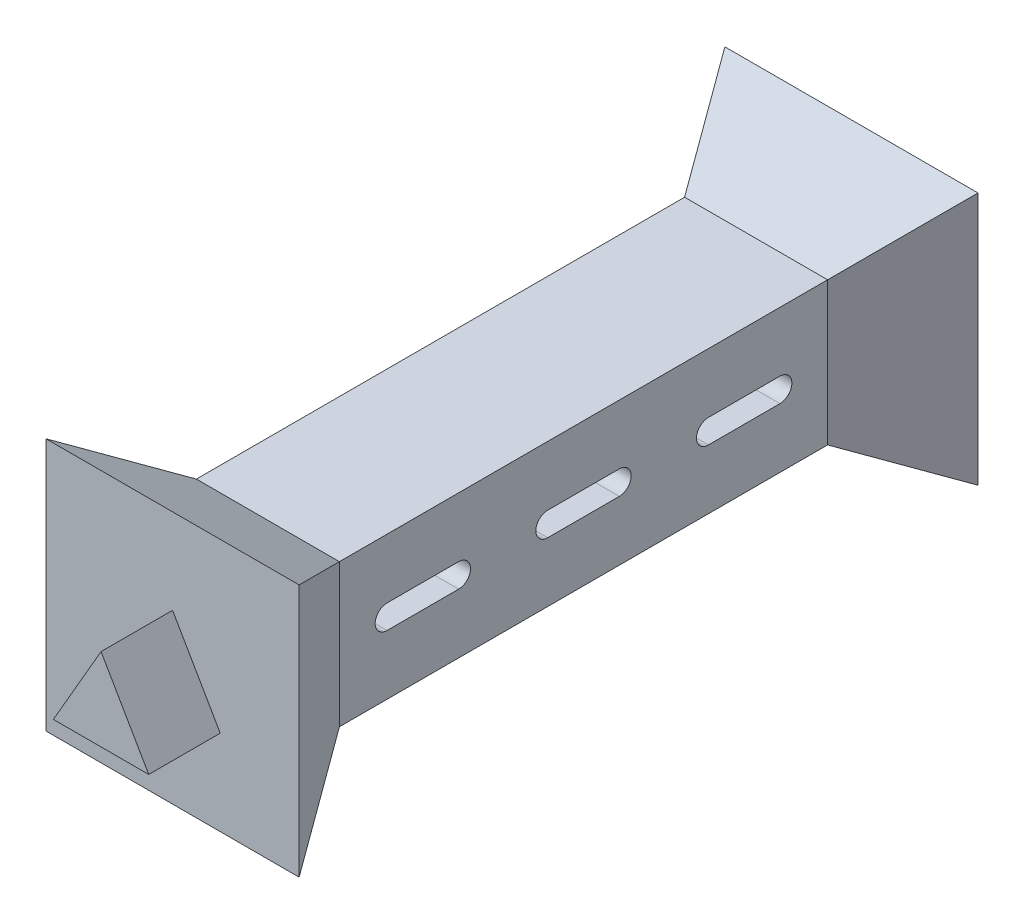
ISO-10303-21;
HEADER;
FILE_DESCRIPTION(('STEP AP214'),'2;1');
FILE_NAME('part.step','',(''),(''),'','','');
FILE_SCHEMA(('AUTOMOTIVE_DESIGN { 1 0 10303 214 1 1 1 1 }'));
ENDSEC;
DATA;
#1=APPLICATION_CONTEXT('core data for automotive mechanical design processes');
#2=APPLICATION_PROTOCOL_DEFINITION('international standard','automotive_design',2000,#1);
#3=PRODUCT_CONTEXT('',#1,'mechanical');
#4=PRODUCT('Part','Part','',(#3));
#5=PRODUCT_RELATED_PRODUCT_CATEGORY('part','',(#4));
#6=PRODUCT_DEFINITION_FORMATION('','',#4);
#7=PRODUCT_DEFINITION_CONTEXT('part definition',#1,'design');
#8=PRODUCT_DEFINITION('design','',#6,#7);
#9=PRODUCT_DEFINITION_SHAPE('','',#8);
#10=(LENGTH_UNIT() NAMED_UNIT(*) SI_UNIT(.MILLI.,.METRE.));
#11=(NAMED_UNIT(*) PLANE_ANGLE_UNIT() SI_UNIT($,.RADIAN.));
#12=(NAMED_UNIT(*) SI_UNIT($,.STERADIAN.) SOLID_ANGLE_UNIT());
#13=UNCERTAINTY_MEASURE_WITH_UNIT(LENGTH_MEASURE(1.E-05),#10,'distance_accuracy_value','');
#14=(GEOMETRIC_REPRESENTATION_CONTEXT(3) GLOBAL_UNCERTAINTY_ASSIGNED_CONTEXT((#13)) GLOBAL_UNIT_ASSIGNED_CONTEXT((#10,
#11,#12)) REPRESENTATION_CONTEXT('',''));
#15=CARTESIAN_POINT('',(0.,0.,0.));
#16=DIRECTION('',(0.,0.,1.));
#17=DIRECTION('',(1.,0.,0.));
#18=AXIS2_PLACEMENT_3D('',#15,#16,#17);
#19=CARTESIAN_POINT('',(0.,0.,-2.));
#20=DIRECTION('',(0.,0.,-1.));
#21=DIRECTION('',(1.,0.,0.));
#22=AXIS2_PLACEMENT_3D('',#19,#20,#21);
#23=PLANE('',#22);
#24=DIRECTION('',(1.,0.,0.));
#25=VECTOR('',#24,1.);
#26=CARTESIAN_POINT('',(-1.5,-2.65470053837925,-2.));
#27=LINE('',#26,#25);
#28=CARTESIAN_POINT('',(-2.65470053837926,-2.65470053837925,-2.));
#29=VERTEX_POINT('',#28);
#30=CARTESIAN_POINT('',(2.65470053837925,-2.65470053837925,-2.));
#31=VERTEX_POINT('',#30);
#32=EDGE_CURVE('E363',#29,#31,#27,.T.);
#33=ORIENTED_EDGE('',*,*,#32,.F.);
#34=DIRECTION('',(0.,-1.,0.));
#35=VECTOR('',#34,1.);
#36=CARTESIAN_POINT('',(-2.65470053837926,1.5,-2.));
#37=LINE('',#36,#35);
#38=CARTESIAN_POINT('',(-2.65470053837926,2.65470053837925,-2.));
#39=VERTEX_POINT('',#38);
#40=EDGE_CURVE('E374',#39,#29,#37,.T.);
#41=ORIENTED_EDGE('',*,*,#40,.F.);
#42=DIRECTION('',(-1.,0.,0.));
#43=VECTOR('',#42,1.);
#44=CARTESIAN_POINT('',(1.5,2.65470053837925,-2.));
#45=LINE('',#44,#43);
#46=CARTESIAN_POINT('',(2.65470053837925,2.65470053837925,-2.));
#47=VERTEX_POINT('',#46);
#48=EDGE_CURVE('E377',#47,#39,#45,.T.);
#49=ORIENTED_EDGE('',*,*,#48,.F.);
#50=DIRECTION('',(0.,1.,0.));
#51=VECTOR('',#50,1.);
#52=CARTESIAN_POINT('',(2.65470053837925,-1.5,-2.));
#53=LINE('',#52,#51);
#54=EDGE_CURVE('E367',#31,#47,#53,.T.);
#55=ORIENTED_EDGE('',*,*,#54,.F.);
#56=EDGE_LOOP('',(#33,#41,#49,#55));
#57=FACE_BOUND('',#56,.T.);
#58=DIRECTION('',(1.,0.,0.));
#59=VECTOR('',#58,1.);
#60=CARTESIAN_POINT('',(-1.,-0.86602540378444,-2.));
#61=LINE('',#60,#59);
#62=CARTESIAN_POINT('',(-1.,-0.86602540378444,-2.));
#63=VERTEX_POINT('',#62);
#64=CARTESIAN_POINT('',(1.,-0.86602540378444,-2.));
#65=VERTEX_POINT('',#64);
#66=EDGE_CURVE('E323',#63,#65,#61,.T.);
#67=ORIENTED_EDGE('',*,*,#66,.T.);
#68=DIRECTION('',(-0.5,0.866025403784439,0.));
#69=VECTOR('',#68,1.);
#70=CARTESIAN_POINT('',(1.,-0.86602540378444,-2.));
#71=LINE('',#70,#69);
#72=CARTESIAN_POINT('',(0.,0.86602540378444,-2.));
#73=VERTEX_POINT('',#72);
#74=EDGE_CURVE('E226',#65,#73,#71,.T.);
#75=ORIENTED_EDGE('',*,*,#74,.T.);
#76=DIRECTION('',(-0.5,-0.866025403784438,0.));
#77=VECTOR('',#76,1.);
#78=CARTESIAN_POINT('',(0.,0.86602540378444,-2.));
#79=LINE('',#78,#77);
#80=EDGE_CURVE('E317',#73,#63,#79,.T.);
#81=ORIENTED_EDGE('',*,*,#80,.T.);
#82=EDGE_LOOP('',(#67,#75,#81));
#83=FACE_BOUND('',#82,.T.);
#84=ADVANCED_FACE('F39',(#57,#83),#23,.T.);
#85=CARTESIAN_POINT('',(1.5,1.5,10.24));
#86=DIRECTION('',(-1.,0.,0.));
#87=DIRECTION('',(0.,0.,1.));
#88=AXIS2_PLACEMENT_3D('',#85,#86,#87);
#89=PLANE('',#88);
#90=DIRECTION('',(0.,0.,-1.));
#91=VECTOR('',#90,1.);
#92=CARTESIAN_POINT('',(1.5,-0.25,9.24));
#93=LINE('',#92,#91);
#94=CARTESIAN_POINT('',(1.5,-0.25,9.24));
#95=VERTEX_POINT('',#94);
#96=CARTESIAN_POINT('',(1.5,-0.25,7.74));
#97=VERTEX_POINT('',#96);
#98=EDGE_CURVE('E236',#95,#97,#93,.T.);
#99=ORIENTED_EDGE('',*,*,#98,.F.);
#100=CARTESIAN_POINT('',(1.5,0.,9.24));
#101=DIRECTION('',(1.,0.,0.));
#102=DIRECTION('',(0.,0.,-1.));
#103=AXIS2_PLACEMENT_3D('',#100,#101,#102);
#104=CIRCLE('',#103,0.25);
#105=CARTESIAN_POINT('',(1.5,0.25,9.24));
#106=VERTEX_POINT('',#105);
#107=EDGE_CURVE('E53',#106,#95,#104,.T.);
#108=ORIENTED_EDGE('',*,*,#107,.F.);
#109=DIRECTION('',(0.,0.,1.));
#110=VECTOR('',#109,1.);
#111=CARTESIAN_POINT('',(1.5,0.25,9.24));
#112=LINE('',#111,#110);
#113=CARTESIAN_POINT('',(1.5,0.25,7.74));
#114=VERTEX_POINT('',#113);
#115=EDGE_CURVE('E217',#114,#106,#112,.T.);
#116=ORIENTED_EDGE('',*,*,#115,.F.);
#117=CARTESIAN_POINT('',(1.5,0.,7.74));
#118=DIRECTION('',(1.,0.,0.));
#119=DIRECTION('',(0.,0.,-1.));
#120=AXIS2_PLACEMENT_3D('',#117,#118,#119);
#121=CIRCLE('',#120,0.25);
#122=EDGE_CURVE('E243',#97,#114,#121,.T.);
#123=ORIENTED_EDGE('',*,*,#122,.F.);
#124=EDGE_LOOP('',(#99,#108,#116,#123));
#125=FACE_BOUND('',#124,.T.);
#126=DIRECTION('',(0.,0.,-1.));
#127=VECTOR('',#126,1.);
#128=CARTESIAN_POINT('',(1.5,-0.25,5.87));
#129=LINE('',#128,#127);
#130=CARTESIAN_POINT('',(1.5,-0.25,5.87));
#131=VERTEX_POINT('',#130);
#132=CARTESIAN_POINT('',(1.5,-0.25,4.37));
#133=VERTEX_POINT('',#132);
#134=EDGE_CURVE('E267',#131,#133,#129,.T.);
#135=ORIENTED_EDGE('',*,*,#134,.F.);
#136=CARTESIAN_POINT('',(1.5,0.,5.87));
#137=DIRECTION('',(1.,0.,0.));
#138=DIRECTION('',(0.,0.,-1.));
#139=AXIS2_PLACEMENT_3D('',#136,#137,#138);
#140=CIRCLE('',#139,0.25);
#141=CARTESIAN_POINT('',(1.5,0.25,5.87));
#142=VERTEX_POINT('',#141);
#143=EDGE_CURVE('E65',#142,#131,#140,.T.);
#144=ORIENTED_EDGE('',*,*,#143,.F.);
#145=DIRECTION('',(0.,0.,1.));
#146=VECTOR('',#145,1.);
#147=CARTESIAN_POINT('',(1.5,0.25,5.87));
#148=LINE('',#147,#146);
#149=CARTESIAN_POINT('',(1.5,0.25,4.37));
#150=VERTEX_POINT('',#149);
#151=EDGE_CURVE('E256',#150,#142,#148,.T.);
#152=ORIENTED_EDGE('',*,*,#151,.F.);
#153=CARTESIAN_POINT('',(1.5,0.,4.37));
#154=DIRECTION('',(1.,0.,0.));
#155=DIRECTION('',(0.,0.,-1.));
#156=AXIS2_PLACEMENT_3D('',#153,#154,#155);
#157=CIRCLE('',#156,0.25);
#158=EDGE_CURVE('E266',#133,#150,#157,.T.);
#159=ORIENTED_EDGE('',*,*,#158,.F.);
#160=EDGE_LOOP('',(#135,#144,#152,#159));
#161=FACE_BOUND('',#160,.T.);
#162=DIRECTION('',(0.,0.,-1.));
#163=VECTOR('',#162,1.);
#164=CARTESIAN_POINT('',(1.5,-0.25,2.5));
#165=LINE('',#164,#163);
#166=CARTESIAN_POINT('',(1.5,-0.25,2.5));
#167=VERTEX_POINT('',#166);
#168=CARTESIAN_POINT('',(1.5,-0.25,1.));
#169=VERTEX_POINT('',#168);
#170=EDGE_CURVE('E297',#167,#169,#165,.T.);
#171=ORIENTED_EDGE('',*,*,#170,.F.);
#172=CARTESIAN_POINT('',(1.5,0.,2.5));
#173=DIRECTION('',(1.,0.,0.));
#174=DIRECTION('',(0.,0.,-1.));
#175=AXIS2_PLACEMENT_3D('',#172,#173,#174);
#176=CIRCLE('',#175,0.25);
#177=CARTESIAN_POINT('',(1.5,0.25,2.5));
#178=VERTEX_POINT('',#177);
#179=EDGE_CURVE('E303',#178,#167,#176,.T.);
#180=ORIENTED_EDGE('',*,*,#179,.F.);
#181=DIRECTION('',(0.,0.,1.));
#182=VECTOR('',#181,1.);
#183=CARTESIAN_POINT('',(1.5,0.25,2.5));
#184=LINE('',#183,#182);
#185=CARTESIAN_POINT('',(1.5,0.25,1.));
#186=VERTEX_POINT('',#185);
#187=EDGE_CURVE('E288',#186,#178,#184,.T.);
#188=ORIENTED_EDGE('',*,*,#187,.F.);
#189=CARTESIAN_POINT('',(1.5,0.,1.));
#190=DIRECTION('',(1.,0.,0.));
#191=DIRECTION('',(0.,0.,-1.));
#192=AXIS2_PLACEMENT_3D('',#189,#190,#191);
#193=CIRCLE('',#192,0.25);
#194=EDGE_CURVE('E300',#169,#186,#193,.T.);
#195=ORIENTED_EDGE('',*,*,#194,.F.);
#196=EDGE_LOOP('',(#171,#180,#188,#195));
#197=FACE_BOUND('',#196,.T.);
#198=DIRECTION('',(0.,1.,0.));
#199=VECTOR('',#198,1.);
#200=CARTESIAN_POINT('',(1.5,1.5,0.));
#201=LINE('',#200,#199);
#202=CARTESIAN_POINT('',(1.5,-1.5,0.));
#203=VERTEX_POINT('',#202);
#204=CARTESIAN_POINT('',(1.5,1.5,0.));
#205=VERTEX_POINT('',#204);
#206=EDGE_CURVE('E387',#203,#205,#201,.T.);
#207=ORIENTED_EDGE('',*,*,#206,.T.);
#208=DIRECTION('',(0.,0.,-1.));
#209=VECTOR('',#208,1.);
#210=CARTESIAN_POINT('',(1.5,1.5,10.24));
#211=LINE('',#210,#209);
#212=CARTESIAN_POINT('',(1.5,1.5,10.24));
#213=VERTEX_POINT('',#212);
#214=EDGE_CURVE('E11',#213,#205,#211,.T.);
#215=ORIENTED_EDGE('',*,*,#214,.F.);
#216=DIRECTION('',(0.,1.,0.));
#217=VECTOR('',#216,1.);
#218=CARTESIAN_POINT('',(1.5,1.5,10.24));
#219=LINE('',#218,#217);
#220=CARTESIAN_POINT('',(1.5,-1.5,10.24));
#221=VERTEX_POINT('',#220);
#222=EDGE_CURVE('E404',#221,#213,#219,.T.);
#223=ORIENTED_EDGE('',*,*,#222,.F.);
#224=DIRECTION('',(0.,0.,-1.));
#225=VECTOR('',#224,1.);
#226=CARTESIAN_POINT('',(1.5,-1.5,10.24));
#227=LINE('',#226,#225);
#228=EDGE_CURVE('E416',#221,#203,#227,.T.);
#229=ORIENTED_EDGE('',*,*,#228,.T.);
#230=EDGE_LOOP('',(#207,#215,#223,#229));
#231=FACE_BOUND('',#230,.T.);
#232=ADVANCED_FACE('F41',(#125,#161,#197,#231),#89,.F.);
#233=CARTESIAN_POINT('',(-1.5,1.5,10.24));
#234=DIRECTION('',(0.,-1.,0.));
#235=DIRECTION('',(0.,0.,-1.));
#236=AXIS2_PLACEMENT_3D('',#233,#234,#235);
#237=PLANE('',#236);
#238=DIRECTION('',(-1.,0.,0.));
#239=VECTOR('',#238,1.);
#240=CARTESIAN_POINT('',(-1.5,1.5,0.));
#241=LINE('',#240,#239);
#242=CARTESIAN_POINT('',(-1.5,1.5,0.));
#243=VERTEX_POINT('',#242);
#244=EDGE_CURVE('E417',#205,#243,#241,.T.);
#245=ORIENTED_EDGE('',*,*,#244,.T.);
#246=DIRECTION('',(0.,0.,-1.));
#247=VECTOR('',#246,1.);
#248=CARTESIAN_POINT('',(-1.5,1.5,10.24));
#249=LINE('',#248,#247);
#250=CARTESIAN_POINT('',(-1.5,1.5,10.24));
#251=VERTEX_POINT('',#250);
#252=EDGE_CURVE('E50',#251,#243,#249,.T.);
#253=ORIENTED_EDGE('',*,*,#252,.F.);
#254=DIRECTION('',(-1.,0.,0.));
#255=VECTOR('',#254,1.);
#256=CARTESIAN_POINT('',(-1.5,1.5,10.24));
#257=LINE('',#256,#255);
#258=EDGE_CURVE('E410',#213,#251,#257,.T.);
#259=ORIENTED_EDGE('',*,*,#258,.F.);
#260=ORIENTED_EDGE('',*,*,#214,.T.);
#261=EDGE_LOOP('',(#245,#253,#259,#260));
#262=FACE_BOUND('',#261,.T.);
#263=ADVANCED_FACE('F436',(#262),#237,.F.);
#264=CARTESIAN_POINT('',(-1.5,1.5,10.24));
#265=DIRECTION('',(1.,0.,0.));
#266=DIRECTION('',(0.,0.,-1.));
#267=AXIS2_PLACEMENT_3D('',#264,#265,#266);
#268=PLANE('',#267);
#269=DIRECTION('',(0.,0.,-1.));
#270=VECTOR('',#269,1.);
#271=CARTESIAN_POINT('',(-1.5,0.25,9.24));
#272=LINE('',#271,#270);
#273=CARTESIAN_POINT('',(-1.5,0.25,9.24));
#274=VERTEX_POINT('',#273);
#275=CARTESIAN_POINT('',(-1.5,0.25,7.74));
#276=VERTEX_POINT('',#275);
#277=EDGE_CURVE('E234',#274,#276,#272,.T.);
#278=ORIENTED_EDGE('',*,*,#277,.F.);
#279=CARTESIAN_POINT('',(-1.5,0.,9.24));
#280=DIRECTION('',(1.,0.,0.));
#281=DIRECTION('',(0.,0.,-1.));
#282=AXIS2_PLACEMENT_3D('',#279,#280,#281);
#283=CIRCLE('',#282,0.25);
#284=CARTESIAN_POINT('',(-1.5,-0.25,9.24));
#285=VERTEX_POINT('',#284);
#286=EDGE_CURVE('E211',#285,#274,#283,.F.);
#287=ORIENTED_EDGE('',*,*,#286,.F.);
#288=DIRECTION('',(0.,0.,1.));
#289=VECTOR('',#288,1.);
#290=CARTESIAN_POINT('',(-1.5,-0.25,9.24));
#291=LINE('',#290,#289);
#292=CARTESIAN_POINT('',(-1.5,-0.25,7.74));
#293=VERTEX_POINT('',#292);
#294=EDGE_CURVE('E223',#293,#285,#291,.T.);
#295=ORIENTED_EDGE('',*,*,#294,.F.);
#296=CARTESIAN_POINT('',(-1.5,0.,7.74));
#297=DIRECTION('',(1.,0.,0.));
#298=DIRECTION('',(0.,0.,-1.));
#299=AXIS2_PLACEMENT_3D('',#296,#297,#298);
#300=CIRCLE('',#299,0.25);
#301=EDGE_CURVE('E238',#276,#293,#300,.F.);
#302=ORIENTED_EDGE('',*,*,#301,.F.);
#303=EDGE_LOOP('',(#278,#287,#295,#302));
#304=FACE_BOUND('',#303,.T.);
#305=DIRECTION('',(0.,0.,-1.));
#306=VECTOR('',#305,1.);
#307=CARTESIAN_POINT('',(-1.5,0.25,5.87));
#308=LINE('',#307,#306);
#309=CARTESIAN_POINT('',(-1.5,0.25,5.87));
#310=VERTEX_POINT('',#309);
#311=CARTESIAN_POINT('',(-1.5,0.25,4.37));
#312=VERTEX_POINT('',#311);
#313=EDGE_CURVE('E280',#310,#312,#308,.T.);
#314=ORIENTED_EDGE('',*,*,#313,.F.);
#315=CARTESIAN_POINT('',(-1.5,0.,5.87));
#316=DIRECTION('',(1.,0.,0.));
#317=DIRECTION('',(0.,0.,-1.));
#318=AXIS2_PLACEMENT_3D('',#315,#316,#317);
#319=CIRCLE('',#318,0.25);
#320=CARTESIAN_POINT('',(-1.5,-0.25,5.87));
#321=VERTEX_POINT('',#320);
#322=EDGE_CURVE('E274',#321,#310,#319,.F.);
#323=ORIENTED_EDGE('',*,*,#322,.F.);
#324=DIRECTION('',(0.,0.,1.));
#325=VECTOR('',#324,1.);
#326=CARTESIAN_POINT('',(-1.5,-0.25,5.87));
#327=LINE('',#326,#325);
#328=CARTESIAN_POINT('',(-1.5,-0.25,4.37));
#329=VERTEX_POINT('',#328);
#330=EDGE_CURVE('E255',#329,#321,#327,.T.);
#331=ORIENTED_EDGE('',*,*,#330,.F.);
#332=CARTESIAN_POINT('',(-1.5,0.,4.37));
#333=DIRECTION('',(1.,0.,0.));
#334=DIRECTION('',(0.,0.,-1.));
#335=AXIS2_PLACEMENT_3D('',#332,#333,#334);
#336=CIRCLE('',#335,0.25);
#337=EDGE_CURVE('E278',#312,#329,#336,.F.);
#338=ORIENTED_EDGE('',*,*,#337,.F.);
#339=EDGE_LOOP('',(#314,#323,#331,#338));
#340=FACE_BOUND('',#339,.T.);
#341=DIRECTION('',(0.,0.,-1.));
#342=VECTOR('',#341,1.);
#343=CARTESIAN_POINT('',(-1.5,0.25,2.5));
#344=LINE('',#343,#342);
#345=CARTESIAN_POINT('',(-1.5,0.25,2.5));
#346=VERTEX_POINT('',#345);
#347=CARTESIAN_POINT('',(-1.5,0.25,1.));
#348=VERTEX_POINT('',#347);
#349=EDGE_CURVE('E308',#346,#348,#344,.T.);
#350=ORIENTED_EDGE('',*,*,#349,.F.);
#351=CARTESIAN_POINT('',(-1.5,0.,2.5));
#352=DIRECTION('',(1.,0.,0.));
#353=DIRECTION('',(0.,0.,-1.));
#354=AXIS2_PLACEMENT_3D('',#351,#352,#353);
#355=CIRCLE('',#354,0.25);
#356=CARTESIAN_POINT('',(-1.5,-0.25,2.5));
#357=VERTEX_POINT('',#356);
#358=EDGE_CURVE('E304',#357,#346,#355,.F.);
#359=ORIENTED_EDGE('',*,*,#358,.F.);
#360=DIRECTION('',(0.,0.,1.));
#361=VECTOR('',#360,1.);
#362=CARTESIAN_POINT('',(-1.5,-0.25,2.5));
#363=LINE('',#362,#361);
#364=CARTESIAN_POINT('',(-1.5,-0.25,0.999999999999999));
#365=VERTEX_POINT('',#364);
#366=EDGE_CURVE('E285',#365,#357,#363,.T.);
#367=ORIENTED_EDGE('',*,*,#366,.F.);
#368=CARTESIAN_POINT('',(-1.5,0.,1.));
#369=DIRECTION('',(1.,0.,0.));
#370=DIRECTION('',(0.,0.,-1.));
#371=AXIS2_PLACEMENT_3D('',#368,#369,#370);
#372=CIRCLE('',#371,0.25);
#373=EDGE_CURVE('E257',#348,#365,#372,.F.);
#374=ORIENTED_EDGE('',*,*,#373,.F.);
#375=EDGE_LOOP('',(#350,#359,#367,#374));
#376=FACE_BOUND('',#375,.T.);
#377=DIRECTION('',(0.,-1.,0.));
#378=VECTOR('',#377,1.);
#379=CARTESIAN_POINT('',(-1.5,1.5,0.));
#380=LINE('',#379,#378);
#381=CARTESIAN_POINT('',(-1.5,-1.5,0.));
#382=VERTEX_POINT('',#381);
#383=EDGE_CURVE('E421',#243,#382,#380,.T.);
#384=ORIENTED_EDGE('',*,*,#383,.T.);
#385=DIRECTION('',(0.,0.,-1.));
#386=VECTOR('',#385,1.);
#387=CARTESIAN_POINT('',(-1.5,-1.5,10.24));
#388=LINE('',#387,#386);
#389=CARTESIAN_POINT('',(-1.5,-1.5,10.24));
#390=VERTEX_POINT('',#389);
#391=EDGE_CURVE('E427',#390,#382,#388,.T.);
#392=ORIENTED_EDGE('',*,*,#391,.F.);
#393=DIRECTION('',(0.,-1.,0.));
#394=VECTOR('',#393,1.);
#395=CARTESIAN_POINT('',(-1.5,1.5,10.24));
#396=LINE('',#395,#394);
#397=EDGE_CURVE('E413',#251,#390,#396,.T.);
#398=ORIENTED_EDGE('',*,*,#397,.F.);
#399=ORIENTED_EDGE('',*,*,#252,.T.);
#400=EDGE_LOOP('',(#384,#392,#398,#399));
#401=FACE_BOUND('',#400,.T.);
#402=ADVANCED_FACE('F233',(#304,#340,#376,#401),#268,.F.);
#403=CARTESIAN_POINT('',(-1.5,-1.5,10.24));
#404=DIRECTION('',(0.,1.,0.));
#405=DIRECTION('',(0.,0.,1.));
#406=AXIS2_PLACEMENT_3D('',#403,#404,#405);
#407=PLANE('',#406);
#408=DIRECTION('',(1.,0.,0.));
#409=VECTOR('',#408,1.);
#410=CARTESIAN_POINT('',(-1.5,-1.5,0.));
#411=LINE('',#410,#409);
#412=EDGE_CURVE('E409',#382,#203,#411,.T.);
#413=ORIENTED_EDGE('',*,*,#412,.T.);
#414=ORIENTED_EDGE('',*,*,#228,.F.);
#415=DIRECTION('',(1.,0.,0.));
#416=VECTOR('',#415,1.);
#417=CARTESIAN_POINT('',(-1.5,-1.5,10.24));
#418=LINE('',#417,#416);
#419=EDGE_CURVE('E414',#390,#221,#418,.T.);
#420=ORIENTED_EDGE('',*,*,#419,.F.);
#421=ORIENTED_EDGE('',*,*,#391,.T.);
#422=EDGE_LOOP('',(#413,#414,#420,#421));
#423=FACE_BOUND('',#422,.T.);
#424=ADVANCED_FACE('F453',(#423),#407,.F.);
#425=CARTESIAN_POINT('',(-1.5,-1.5,10.24));
#426=DIRECTION('',(0.,-0.866025403784438,-0.500000000000001));
#427=DIRECTION('',(0.,0.500000000000001,-0.866025403784438));
#428=AXIS2_PLACEMENT_3D('',#425,#426,#427);
#429=PLANE('',#428);
#430=ORIENTED_EDGE('',*,*,#419,.T.);
#431=DIRECTION('',(-0.447213595499959,0.447213595499959,-0.774596669241482));
#432=VECTOR('',#431,1.);
#433=CARTESIAN_POINT('',(1.5,-1.5,10.24));
#434=LINE('',#433,#432);
#435=CARTESIAN_POINT('',(2.65470053837925,-2.65470053837925,12.24));
#436=VERTEX_POINT('',#435);
#437=EDGE_CURVE('E384',#436,#221,#434,.T.);
#438=ORIENTED_EDGE('',*,*,#437,.F.);
#439=DIRECTION('',(-1.,0.,0.));
#440=VECTOR('',#439,1.);
#441=CARTESIAN_POINT('',(-1.5,-2.65470053837925,12.24));
#442=LINE('',#441,#440);
#443=CARTESIAN_POINT('',(-2.65470053837926,-2.65470053837925,12.24));
#444=VERTEX_POINT('',#443);
#445=EDGE_CURVE('E364',#444,#436,#442,.F.);
#446=ORIENTED_EDGE('',*,*,#445,.F.);
#447=DIRECTION('',(0.447213595499959,0.447213595499959,-0.774596669241482));
#448=VECTOR('',#447,1.);
#449=CARTESIAN_POINT('',(-1.5,-1.5,10.24));
#450=LINE('',#449,#448);
#451=EDGE_CURVE('E389',#444,#390,#450,.T.);
#452=ORIENTED_EDGE('',*,*,#451,.T.);
#453=EDGE_LOOP('',(#430,#438,#446,#452));
#454=FACE_BOUND('',#453,.T.);
#455=ADVANCED_FACE('F475',(#454),#429,.T.);
#456=CARTESIAN_POINT('',(1.5,-1.5,10.24));
#457=DIRECTION('',(0.866025403784438,0.,-0.500000000000001));
#458=DIRECTION('',(-0.500000000000001,0.,-0.866025403784438));
#459=AXIS2_PLACEMENT_3D('',#456,#457,#458);
#460=PLANE('',#459);
#461=ORIENTED_EDGE('',*,*,#222,.T.);
#462=DIRECTION('',(-0.447213595499959,-0.447213595499959,-0.774596669241482));
#463=VECTOR('',#462,1.);
#464=CARTESIAN_POINT('',(1.5,1.5,10.24));
#465=LINE('',#464,#463);
#466=CARTESIAN_POINT('',(2.65470053837925,2.65470053837925,12.24));
#467=VERTEX_POINT('',#466);
#468=EDGE_CURVE('E390',#467,#213,#465,.T.);
#469=ORIENTED_EDGE('',*,*,#468,.F.);
#470=DIRECTION('',(0.,-1.,0.));
#471=VECTOR('',#470,1.);
#472=CARTESIAN_POINT('',(2.65470053837925,-1.5,12.24));
#473=LINE('',#472,#471);
#474=EDGE_CURVE('E398',#436,#467,#473,.F.);
#475=ORIENTED_EDGE('',*,*,#474,.F.);
#476=ORIENTED_EDGE('',*,*,#437,.T.);
#477=EDGE_LOOP('',(#461,#469,#475,#476));
#478=FACE_BOUND('',#477,.T.);
#479=ADVANCED_FACE('F457',(#478),#460,.T.);
#480=CARTESIAN_POINT('',(1.5,1.5,10.24));
#481=DIRECTION('',(0.,0.866025403784438,-0.500000000000001));
#482=DIRECTION('',(0.,-0.500000000000001,-0.866025403784438));
#483=AXIS2_PLACEMENT_3D('',#480,#481,#482);
#484=PLANE('',#483);
#485=ORIENTED_EDGE('',*,*,#258,.T.);
#486=DIRECTION('',(0.447213595499959,-0.447213595499959,-0.774596669241482));
#487=VECTOR('',#486,1.);
#488=CARTESIAN_POINT('',(-1.5,1.5,10.24));
#489=LINE('',#488,#487);
#490=CARTESIAN_POINT('',(-2.65470053837926,2.65470053837925,12.24));
#491=VERTEX_POINT('',#490);
#492=EDGE_CURVE('E393',#491,#251,#489,.T.);
#493=ORIENTED_EDGE('',*,*,#492,.F.);
#494=DIRECTION('',(1.,0.,0.));
#495=VECTOR('',#494,1.);
#496=CARTESIAN_POINT('',(1.5,2.65470053837925,12.24));
#497=LINE('',#496,#495);
#498=EDGE_CURVE('E402',#467,#491,#497,.F.);
#499=ORIENTED_EDGE('',*,*,#498,.F.);
#500=ORIENTED_EDGE('',*,*,#468,.T.);
#501=EDGE_LOOP('',(#485,#493,#499,#500));
#502=FACE_BOUND('',#501,.T.);
#503=ADVANCED_FACE('F463',(#502),#484,.T.);
#504=CARTESIAN_POINT('',(-1.5,1.5,10.24));
#505=DIRECTION('',(-0.866025403784438,0.,-0.500000000000001));
#506=DIRECTION('',(0.500000000000001,0.,-0.866025403784438));
#507=AXIS2_PLACEMENT_3D('',#504,#505,#506);
#508=PLANE('',#507);
#509=ORIENTED_EDGE('',*,*,#397,.T.);
#510=ORIENTED_EDGE('',*,*,#451,.F.);
#511=DIRECTION('',(0.,1.,0.));
#512=VECTOR('',#511,1.);
#513=CARTESIAN_POINT('',(-2.65470053837926,1.5,12.24));
#514=LINE('',#513,#512);
#515=EDGE_CURVE('E395',#491,#444,#514,.F.);
#516=ORIENTED_EDGE('',*,*,#515,.F.);
#517=ORIENTED_EDGE('',*,*,#492,.T.);
#518=EDGE_LOOP('',(#509,#510,#516,#517));
#519=FACE_BOUND('',#518,.T.);
#520=ADVANCED_FACE('F471',(#519),#508,.T.);
#521=CARTESIAN_POINT('',(0.,0.,12.24));
#522=DIRECTION('',(0.,0.,1.));
#523=DIRECTION('',(1.,0.,0.));
#524=AXIS2_PLACEMENT_3D('',#521,#522,#523);
#525=PLANE('',#524);
#526=DIRECTION('',(-0.5,0.866025403784439,0.));
#527=VECTOR('',#526,1.);
#528=CARTESIAN_POINT('',(1.,-0.86602540378444,12.24));
#529=LINE('',#528,#527);
#530=CARTESIAN_POINT('',(1.,-0.86602540378444,12.24));
#531=VERTEX_POINT('',#530);
#532=CARTESIAN_POINT('',(0.,0.86602540378444,12.24));
#533=VERTEX_POINT('',#532);
#534=EDGE_CURVE('E337',#531,#533,#529,.T.);
#535=ORIENTED_EDGE('',*,*,#534,.F.);
#536=DIRECTION('',(1.,0.,0.));
#537=VECTOR('',#536,1.);
#538=CARTESIAN_POINT('',(-1.,-0.86602540378444,12.24));
#539=LINE('',#538,#537);
#540=CARTESIAN_POINT('',(-1.,-0.86602540378444,12.24));
#541=VERTEX_POINT('',#540);
#542=EDGE_CURVE('E342',#541,#531,#539,.T.);
#543=ORIENTED_EDGE('',*,*,#542,.F.);
#544=DIRECTION('',(-0.5,-0.866025403784438,0.));
#545=VECTOR('',#544,1.);
#546=CARTESIAN_POINT('',(0.,0.86602540378444,12.24));
#547=LINE('',#546,#545);
#548=EDGE_CURVE('E346',#533,#541,#547,.T.);
#549=ORIENTED_EDGE('',*,*,#548,.F.);
#550=EDGE_LOOP('',(#535,#543,#549));
#551=FACE_BOUND('',#550,.T.);
#552=ORIENTED_EDGE('',*,*,#445,.T.);
#553=ORIENTED_EDGE('',*,*,#474,.T.);
#554=ORIENTED_EDGE('',*,*,#498,.T.);
#555=ORIENTED_EDGE('',*,*,#515,.T.);
#556=EDGE_LOOP('',(#552,#553,#554,#555));
#557=FACE_BOUND('',#556,.T.);
#558=ADVANCED_FACE('F466',(#551,#557),#525,.T.);
#559=CARTESIAN_POINT('',(-1.5,-1.5,0.));
#560=DIRECTION('',(0.,-0.866025403784438,0.500000000000001));
#561=DIRECTION('',(0.,0.500000000000001,0.866025403784438));
#562=AXIS2_PLACEMENT_3D('',#559,#560,#561);
#563=PLANE('',#562);
#564=ORIENTED_EDGE('',*,*,#412,.F.);
#565=DIRECTION('',(0.447213595499959,0.447213595499959,0.774596669241482));
#566=VECTOR('',#565,1.);
#567=CARTESIAN_POINT('',(-0.899999999999999,-0.899999999999998,1.03923048454133));
#568=LINE('',#567,#566);
#569=EDGE_CURVE('E365',#29,#382,#568,.T.);
#570=ORIENTED_EDGE('',*,*,#569,.F.);
#571=ORIENTED_EDGE('',*,*,#32,.T.);
#572=DIRECTION('',(-0.447213595499959,0.447213595499959,0.774596669241482));
#573=VECTOR('',#572,1.);
#574=CARTESIAN_POINT('',(0.899999999999996,-0.899999999999998,1.03923048454133));
#575=LINE('',#574,#573);
#576=EDGE_CURVE('E366',#31,#203,#575,.T.);
#577=ORIENTED_EDGE('',*,*,#576,.T.);
#578=EDGE_LOOP('',(#564,#570,#571,#577));
#579=FACE_BOUND('',#578,.T.);
#580=ADVANCED_FACE('F452',(#579),#563,.T.);
#581=CARTESIAN_POINT('',(-1.5,1.5,0.));
#582=DIRECTION('',(-0.866025403784438,0.,0.500000000000001));
#583=DIRECTION('',(0.500000000000001,0.,0.866025403784438));
#584=AXIS2_PLACEMENT_3D('',#581,#582,#583);
#585=PLANE('',#584);
#586=ORIENTED_EDGE('',*,*,#383,.F.);
#587=DIRECTION('',(0.447213595499959,-0.447213595499959,0.774596669241482));
#588=VECTOR('',#587,1.);
#589=CARTESIAN_POINT('',(-0.899999999999999,0.899999999999998,1.03923048454133));
#590=LINE('',#589,#588);
#591=EDGE_CURVE('E362',#39,#243,#590,.T.);
#592=ORIENTED_EDGE('',*,*,#591,.F.);
#593=ORIENTED_EDGE('',*,*,#40,.T.);
#594=ORIENTED_EDGE('',*,*,#569,.T.);
#595=EDGE_LOOP('',(#586,#592,#593,#594));
#596=FACE_BOUND('',#595,.T.);
#597=ADVANCED_FACE('F443',(#596),#585,.T.);
#598=CARTESIAN_POINT('',(1.5,1.5,0.));
#599=DIRECTION('',(0.,0.866025403784438,0.500000000000001));
#600=DIRECTION('',(0.,-0.500000000000001,0.866025403784438));
#601=AXIS2_PLACEMENT_3D('',#598,#599,#600);
#602=PLANE('',#601);
#603=ORIENTED_EDGE('',*,*,#244,.F.);
#604=DIRECTION('',(-0.447213595499959,-0.447213595499959,0.774596669241482));
#605=VECTOR('',#604,1.);
#606=CARTESIAN_POINT('',(0.899999999999996,0.899999999999998,1.03923048454133));
#607=LINE('',#606,#605);
#608=EDGE_CURVE('E368',#47,#205,#607,.T.);
#609=ORIENTED_EDGE('',*,*,#608,.F.);
#610=ORIENTED_EDGE('',*,*,#48,.T.);
#611=ORIENTED_EDGE('',*,*,#591,.T.);
#612=EDGE_LOOP('',(#603,#609,#610,#611));
#613=FACE_BOUND('',#612,.T.);
#614=ADVANCED_FACE('F439',(#613),#602,.T.);
#615=CARTESIAN_POINT('',(1.5,-1.5,0.));
#616=DIRECTION('',(0.866025403784438,0.,0.500000000000001));
#617=DIRECTION('',(-0.500000000000001,0.,0.866025403784438));
#618=AXIS2_PLACEMENT_3D('',#615,#616,#617);
#619=PLANE('',#618);
#620=ORIENTED_EDGE('',*,*,#206,.F.);
#621=ORIENTED_EDGE('',*,*,#576,.F.);
#622=ORIENTED_EDGE('',*,*,#54,.T.);
#623=ORIENTED_EDGE('',*,*,#608,.T.);
#624=EDGE_LOOP('',(#620,#621,#622,#623));
#625=FACE_BOUND('',#624,.T.);
#626=ADVANCED_FACE('F499',(#625),#619,.T.);
#627=CARTESIAN_POINT('',(1.,-0.86602540378444,13.74));
#628=DIRECTION('',(-0.866025403784439,-0.5,0.));
#629=DIRECTION('',(0.5,-0.866025403784439,0.));
#630=AXIS2_PLACEMENT_3D('',#627,#628,#629);
#631=PLANE('',#630);
#632=ORIENTED_EDGE('',*,*,#534,.T.);
#633=DIRECTION('',(0.,0.,-1.));
#634=VECTOR('',#633,1.);
#635=CARTESIAN_POINT('',(0.,0.86602540378444,13.74));
#636=LINE('',#635,#634);
#637=CARTESIAN_POINT('',(0.,0.86602540378444,13.74));
#638=VERTEX_POINT('',#637);
#639=EDGE_CURVE('E356',#638,#533,#636,.T.);
#640=ORIENTED_EDGE('',*,*,#639,.F.);
#641=DIRECTION('',(-0.5,0.866025403784439,0.));
#642=VECTOR('',#641,1.);
#643=CARTESIAN_POINT('',(1.,-0.86602540378444,13.74));
#644=LINE('',#643,#642);
#645=CARTESIAN_POINT('',(1.,-0.86602540378444,13.74));
#646=VERTEX_POINT('',#645);
#647=EDGE_CURVE('E340',#646,#638,#644,.T.);
#648=ORIENTED_EDGE('',*,*,#647,.F.);
#649=DIRECTION('',(0.,0.,-1.));
#650=VECTOR('',#649,1.);
#651=CARTESIAN_POINT('',(1.,-0.86602540378444,13.74));
#652=LINE('',#651,#650);
#653=EDGE_CURVE('E343',#646,#531,#652,.T.);
#654=ORIENTED_EDGE('',*,*,#653,.T.);
#655=EDGE_LOOP('',(#632,#640,#648,#654));
#656=FACE_BOUND('',#655,.T.);
#657=ADVANCED_FACE('F496',(#656),#631,.F.);
#658=CARTESIAN_POINT('',(0.,0.86602540378444,13.74));
#659=DIRECTION('',(0.866025403784438,-0.5,0.));
#660=DIRECTION('',(0.5,0.866025403784438,0.));
#661=AXIS2_PLACEMENT_3D('',#658,#659,#660);
#662=PLANE('',#661);
#663=ORIENTED_EDGE('',*,*,#548,.T.);
#664=DIRECTION('',(0.,0.,-1.));
#665=VECTOR('',#664,1.);
#666=CARTESIAN_POINT('',(-1.,-0.86602540378444,13.74));
#667=LINE('',#666,#665);
#668=CARTESIAN_POINT('',(-1.,-0.86602540378444,13.74));
#669=VERTEX_POINT('',#668);
#670=EDGE_CURVE('E352',#669,#541,#667,.T.);
#671=ORIENTED_EDGE('',*,*,#670,.F.);
#672=DIRECTION('',(-0.5,-0.866025403784438,0.));
#673=VECTOR('',#672,1.);
#674=CARTESIAN_POINT('',(0.,0.86602540378444,13.74));
#675=LINE('',#674,#673);
#676=EDGE_CURVE('E338',#638,#669,#675,.T.);
#677=ORIENTED_EDGE('',*,*,#676,.F.);
#678=ORIENTED_EDGE('',*,*,#639,.T.);
#679=EDGE_LOOP('',(#663,#671,#677,#678));
#680=FACE_BOUND('',#679,.T.);
#681=ADVANCED_FACE('F592',(#680),#662,.F.);
#682=CARTESIAN_POINT('',(-1.,-0.86602540378444,13.74));
#683=DIRECTION('',(0.,1.,0.));
#684=DIRECTION('',(-1.,0.,0.));
#685=AXIS2_PLACEMENT_3D('',#682,#683,#684);
#686=PLANE('',#685);
#687=ORIENTED_EDGE('',*,*,#542,.T.);
#688=ORIENTED_EDGE('',*,*,#653,.F.);
#689=DIRECTION('',(1.,0.,0.));
#690=VECTOR('',#689,1.);
#691=CARTESIAN_POINT('',(-1.,-0.86602540378444,13.74));
#692=LINE('',#691,#690);
#693=EDGE_CURVE('E344',#669,#646,#692,.T.);
#694=ORIENTED_EDGE('',*,*,#693,.F.);
#695=ORIENTED_EDGE('',*,*,#670,.T.);
#696=EDGE_LOOP('',(#687,#688,#694,#695));
#697=FACE_BOUND('',#696,.T.);
#698=ADVANCED_FACE('F601',(#697),#686,.F.);
#699=CARTESIAN_POINT('',(0.,0.,13.74));
#700=DIRECTION('',(0.,0.,1.));
#701=DIRECTION('',(1.,0.,0.));
#702=AXIS2_PLACEMENT_3D('',#699,#700,#701);
#703=PLANE('',#702);
#704=ORIENTED_EDGE('',*,*,#647,.T.);
#705=ORIENTED_EDGE('',*,*,#676,.T.);
#706=ORIENTED_EDGE('',*,*,#693,.T.);
#707=EDGE_LOOP('',(#704,#705,#706));
#708=FACE_BOUND('',#707,.T.);
#709=ADVANCED_FACE('F615',(#708),#703,.T.);
#710=CARTESIAN_POINT('',(1.,-0.86602540378444,-3.5));
#711=DIRECTION('',(0.866025403784439,0.5,0.));
#712=DIRECTION('',(-0.5,0.866025403784439,0.));
#713=AXIS2_PLACEMENT_3D('',#710,#711,#712);
#714=PLANE('',#713);
#715=ORIENTED_EDGE('',*,*,#74,.F.);
#716=DIRECTION('',(0.,0.,1.));
#717=VECTOR('',#716,1.);
#718=CARTESIAN_POINT('',(1.,-0.86602540378444,-3.5));
#719=LINE('',#718,#717);
#720=CARTESIAN_POINT('',(1.,-0.86602540378444,-3.5));
#721=VERTEX_POINT('',#720);
#722=EDGE_CURVE('E335',#721,#65,#719,.T.);
#723=ORIENTED_EDGE('',*,*,#722,.F.);
#724=DIRECTION('',(-0.5,0.866025403784439,0.));
#725=VECTOR('',#724,1.);
#726=CARTESIAN_POINT('',(1.,-0.86602540378444,-3.5));
#727=LINE('',#726,#725);
#728=CARTESIAN_POINT('',(0.,0.86602540378444,-3.5));
#729=VERTEX_POINT('',#728);
#730=EDGE_CURVE('E315',#721,#729,#727,.T.);
#731=ORIENTED_EDGE('',*,*,#730,.T.);
#732=DIRECTION('',(0.,0.,1.));
#733=VECTOR('',#732,1.);
#734=CARTESIAN_POINT('',(0.,0.86602540378444,-3.5));
#735=LINE('',#734,#733);
#736=EDGE_CURVE('E325',#729,#73,#735,.T.);
#737=ORIENTED_EDGE('',*,*,#736,.T.);
#738=EDGE_LOOP('',(#715,#723,#731,#737));
#739=FACE_BOUND('',#738,.T.);
#740=ADVANCED_FACE('F625',(#739),#714,.T.);
#741=CARTESIAN_POINT('',(-1.,-0.86602540378444,-3.5));
#742=DIRECTION('',(0.,-1.,0.));
#743=DIRECTION('',(1.,0.,0.));
#744=AXIS2_PLACEMENT_3D('',#741,#742,#743);
#745=PLANE('',#744);
#746=ORIENTED_EDGE('',*,*,#66,.F.);
#747=DIRECTION('',(0.,0.,1.));
#748=VECTOR('',#747,1.);
#749=CARTESIAN_POINT('',(-1.,-0.86602540378444,-3.5));
#750=LINE('',#749,#748);
#751=CARTESIAN_POINT('',(-1.,-0.86602540378444,-3.5));
#752=VERTEX_POINT('',#751);
#753=EDGE_CURVE('E334',#752,#63,#750,.T.);
#754=ORIENTED_EDGE('',*,*,#753,.F.);
#755=DIRECTION('',(1.,0.,0.));
#756=VECTOR('',#755,1.);
#757=CARTESIAN_POINT('',(-1.,-0.86602540378444,-3.5));
#758=LINE('',#757,#756);
#759=EDGE_CURVE('E314',#752,#721,#758,.T.);
#760=ORIENTED_EDGE('',*,*,#759,.T.);
#761=ORIENTED_EDGE('',*,*,#722,.T.);
#762=EDGE_LOOP('',(#746,#754,#760,#761));
#763=FACE_BOUND('',#762,.T.);
#764=ADVANCED_FACE('F634',(#763),#745,.T.);
#765=CARTESIAN_POINT('',(0.,0.86602540378444,-3.5));
#766=DIRECTION('',(-0.866025403784438,0.5,0.));
#767=DIRECTION('',(-0.5,-0.866025403784438,0.));
#768=AXIS2_PLACEMENT_3D('',#765,#766,#767);
#769=PLANE('',#768);
#770=ORIENTED_EDGE('',*,*,#80,.F.);
#771=ORIENTED_EDGE('',*,*,#736,.F.);
#772=DIRECTION('',(-0.5,-0.866025403784438,0.));
#773=VECTOR('',#772,1.);
#774=CARTESIAN_POINT('',(0.,0.86602540378444,-3.5));
#775=LINE('',#774,#773);
#776=EDGE_CURVE('E316',#729,#752,#775,.T.);
#777=ORIENTED_EDGE('',*,*,#776,.T.);
#778=ORIENTED_EDGE('',*,*,#753,.T.);
#779=EDGE_LOOP('',(#770,#771,#777,#778));
#780=FACE_BOUND('',#779,.T.);
#781=ADVANCED_FACE('F643',(#780),#769,.T.);
#782=CARTESIAN_POINT('',(0.,0.,-3.5));
#783=DIRECTION('',(0.,0.,-1.));
#784=DIRECTION('',(1.,0.,0.));
#785=AXIS2_PLACEMENT_3D('',#782,#783,#784);
#786=PLANE('',#785);
#787=ORIENTED_EDGE('',*,*,#730,.F.);
#788=ORIENTED_EDGE('',*,*,#759,.F.);
#789=ORIENTED_EDGE('',*,*,#776,.F.);
#790=EDGE_LOOP('',(#787,#788,#789));
#791=FACE_BOUND('',#790,.T.);
#792=ADVANCED_FACE('F652',(#791),#786,.T.);
#793=CARTESIAN_POINT('',(-2.65570053837926,0.,2.5));
#794=DIRECTION('',(1.,0.,0.));
#795=DIRECTION('',(0.,0.,-1.));
#796=AXIS2_PLACEMENT_3D('',#793,#794,#795);
#797=CYLINDRICAL_SURFACE('',#796,0.25);
#798=ORIENTED_EDGE('',*,*,#358,.T.);
#799=DIRECTION('',(1.,0.,0.));
#800=VECTOR('',#799,1.);
#801=CARTESIAN_POINT('',(-2.65570053837926,0.25,2.5));
#802=LINE('',#801,#800);
#803=EDGE_CURVE('E282',#346,#178,#802,.T.);
#804=ORIENTED_EDGE('',*,*,#803,.T.);
#805=ORIENTED_EDGE('',*,*,#179,.T.);
#806=DIRECTION('',(1.,0.,0.));
#807=VECTOR('',#806,1.);
#808=CARTESIAN_POINT('',(-2.65570053837926,-0.25,2.5));
#809=LINE('',#808,#807);
#810=EDGE_CURVE('E289',#357,#167,#809,.T.);
#811=ORIENTED_EDGE('',*,*,#810,.F.);
#812=EDGE_LOOP('',(#798,#804,#805,#811));
#813=FACE_BOUND('',#812,.T.);
#814=ADVANCED_FACE('F663',(#813),#797,.F.);
#815=CARTESIAN_POINT('',(-2.65570053837926,0.25,2.5));
#816=DIRECTION('',(0.,1.,0.));
#817=DIRECTION('',(0.,0.,1.));
#818=AXIS2_PLACEMENT_3D('',#815,#816,#817);
#819=PLANE('',#818);
#820=ORIENTED_EDGE('',*,*,#349,.T.);
#821=DIRECTION('',(1.,0.,0.));
#822=VECTOR('',#821,1.);
#823=CARTESIAN_POINT('',(-2.65570053837926,0.25,1.));
#824=LINE('',#823,#822);
#825=EDGE_CURVE('E292',#348,#186,#824,.T.);
#826=ORIENTED_EDGE('',*,*,#825,.T.);
#827=ORIENTED_EDGE('',*,*,#187,.T.);
#828=ORIENTED_EDGE('',*,*,#803,.F.);
#829=EDGE_LOOP('',(#820,#826,#827,#828));
#830=FACE_BOUND('',#829,.T.);
#831=ADVANCED_FACE('F674',(#830),#819,.F.);
#832=CARTESIAN_POINT('',(-2.65570053837926,0.,1.));
#833=DIRECTION('',(1.,0.,0.));
#834=DIRECTION('',(0.,0.,-1.));
#835=AXIS2_PLACEMENT_3D('',#832,#833,#834);
#836=CYLINDRICAL_SURFACE('',#835,0.25);
#837=ORIENTED_EDGE('',*,*,#373,.T.);
#838=DIRECTION('',(1.,0.,0.));
#839=VECTOR('',#838,1.);
#840=CARTESIAN_POINT('',(-2.65570053837926,-0.25,1.));
#841=LINE('',#840,#839);
#842=EDGE_CURVE('E287',#365,#169,#841,.T.);
#843=ORIENTED_EDGE('',*,*,#842,.T.);
#844=ORIENTED_EDGE('',*,*,#194,.T.);
#845=ORIENTED_EDGE('',*,*,#825,.F.);
#846=EDGE_LOOP('',(#837,#843,#844,#845));
#847=FACE_BOUND('',#846,.T.);
#848=ADVANCED_FACE('F685',(#847),#836,.F.);
#849=CARTESIAN_POINT('',(-2.65570053837926,-0.25,2.5));
#850=DIRECTION('',(0.,-1.,0.));
#851=DIRECTION('',(0.,0.,-1.));
#852=AXIS2_PLACEMENT_3D('',#849,#850,#851);
#853=PLANE('',#852);
#854=ORIENTED_EDGE('',*,*,#366,.T.);
#855=ORIENTED_EDGE('',*,*,#810,.T.);
#856=ORIENTED_EDGE('',*,*,#170,.T.);
#857=ORIENTED_EDGE('',*,*,#842,.F.);
#858=EDGE_LOOP('',(#854,#855,#856,#857));
#859=FACE_BOUND('',#858,.T.);
#860=ADVANCED_FACE('F692',(#859),#853,.F.);
#861=CARTESIAN_POINT('',(-2.65570053837926,0.,5.87));
#862=DIRECTION('',(1.,0.,0.));
#863=DIRECTION('',(0.,0.,-1.));
#864=AXIS2_PLACEMENT_3D('',#861,#862,#863);
#865=CYLINDRICAL_SURFACE('',#864,0.25);
#866=ORIENTED_EDGE('',*,*,#322,.T.);
#867=DIRECTION('',(1.,0.,0.));
#868=VECTOR('',#867,1.);
#869=CARTESIAN_POINT('',(-2.65570053837926,0.25,5.87));
#870=LINE('',#869,#868);
#871=EDGE_CURVE('E253',#310,#142,#870,.T.);
#872=ORIENTED_EDGE('',*,*,#871,.T.);
#873=ORIENTED_EDGE('',*,*,#143,.T.);
#874=DIRECTION('',(1.,0.,0.));
#875=VECTOR('',#874,1.);
#876=CARTESIAN_POINT('',(-2.65570053837926,-0.25,5.87));
#877=LINE('',#876,#875);
#878=EDGE_CURVE('E260',#321,#131,#877,.T.);
#879=ORIENTED_EDGE('',*,*,#878,.F.);
#880=EDGE_LOOP('',(#866,#872,#873,#879));
#881=FACE_BOUND('',#880,.T.);
#882=ADVANCED_FACE('F703',(#881),#865,.F.);
#883=CARTESIAN_POINT('',(-2.65570053837926,0.25,5.87));
#884=DIRECTION('',(0.,1.,0.));
#885=DIRECTION('',(0.,0.,1.));
#886=AXIS2_PLACEMENT_3D('',#883,#884,#885);
#887=PLANE('',#886);
#888=ORIENTED_EDGE('',*,*,#313,.T.);
#889=DIRECTION('',(1.,0.,0.));
#890=VECTOR('',#889,1.);
#891=CARTESIAN_POINT('',(-2.65570053837926,0.25,4.37));
#892=LINE('',#891,#890);
#893=EDGE_CURVE('E265',#312,#150,#892,.T.);
#894=ORIENTED_EDGE('',*,*,#893,.T.);
#895=ORIENTED_EDGE('',*,*,#151,.T.);
#896=ORIENTED_EDGE('',*,*,#871,.F.);
#897=EDGE_LOOP('',(#888,#894,#895,#896));
#898=FACE_BOUND('',#897,.T.);
#899=ADVANCED_FACE('F711',(#898),#887,.F.);
#900=CARTESIAN_POINT('',(-2.65570053837926,0.,4.37));
#901=DIRECTION('',(1.,0.,0.));
#902=DIRECTION('',(0.,0.,-1.));
#903=AXIS2_PLACEMENT_3D('',#900,#901,#902);
#904=CYLINDRICAL_SURFACE('',#903,0.25);
#905=ORIENTED_EDGE('',*,*,#337,.T.);
#906=DIRECTION('',(1.,0.,0.));
#907=VECTOR('',#906,1.);
#908=CARTESIAN_POINT('',(-2.65570053837926,-0.25,4.37));
#909=LINE('',#908,#907);
#910=EDGE_CURVE('E258',#329,#133,#909,.T.);
#911=ORIENTED_EDGE('',*,*,#910,.T.);
#912=ORIENTED_EDGE('',*,*,#158,.T.);
#913=ORIENTED_EDGE('',*,*,#893,.F.);
#914=EDGE_LOOP('',(#905,#911,#912,#913));
#915=FACE_BOUND('',#914,.T.);
#916=ADVANCED_FACE('F725',(#915),#904,.F.);
#917=CARTESIAN_POINT('',(-2.65570053837926,-0.25,5.87));
#918=DIRECTION('',(0.,-1.,0.));
#919=DIRECTION('',(0.,0.,-1.));
#920=AXIS2_PLACEMENT_3D('',#917,#918,#919);
#921=PLANE('',#920);
#922=ORIENTED_EDGE('',*,*,#330,.T.);
#923=ORIENTED_EDGE('',*,*,#878,.T.);
#924=ORIENTED_EDGE('',*,*,#134,.T.);
#925=ORIENTED_EDGE('',*,*,#910,.F.);
#926=EDGE_LOOP('',(#922,#923,#924,#925));
#927=FACE_BOUND('',#926,.T.);
#928=ADVANCED_FACE('F734',(#927),#921,.F.);
#929=CARTESIAN_POINT('',(-2.65570053837926,0.,9.24));
#930=DIRECTION('',(1.,0.,0.));
#931=DIRECTION('',(0.,0.,-1.));
#932=AXIS2_PLACEMENT_3D('',#929,#930,#931);
#933=CYLINDRICAL_SURFACE('',#932,0.25);
#934=ORIENTED_EDGE('',*,*,#286,.T.);
#935=DIRECTION('',(1.,0.,0.));
#936=VECTOR('',#935,1.);
#937=CARTESIAN_POINT('',(-2.65570053837926,0.25,9.24));
#938=LINE('',#937,#936);
#939=EDGE_CURVE('E230',#274,#106,#938,.T.);
#940=ORIENTED_EDGE('',*,*,#939,.T.);
#941=ORIENTED_EDGE('',*,*,#107,.T.);
#942=DIRECTION('',(1.,0.,0.));
#943=VECTOR('',#942,1.);
#944=CARTESIAN_POINT('',(-2.65570053837926,-0.25,9.24));
#945=LINE('',#944,#943);
#946=EDGE_CURVE('E208',#285,#95,#945,.T.);
#947=ORIENTED_EDGE('',*,*,#946,.F.);
#948=EDGE_LOOP('',(#934,#940,#941,#947));
#949=FACE_BOUND('',#948,.T.);
#950=ADVANCED_FACE('F215',(#949),#933,.F.);
#951=CARTESIAN_POINT('',(-2.65570053837926,0.25,9.24));
#952=DIRECTION('',(0.,1.,0.));
#953=DIRECTION('',(0.,0.,1.));
#954=AXIS2_PLACEMENT_3D('',#951,#952,#953);
#955=PLANE('',#954);
#956=ORIENTED_EDGE('',*,*,#277,.T.);
#957=DIRECTION('',(1.,0.,0.));
#958=VECTOR('',#957,1.);
#959=CARTESIAN_POINT('',(-2.65570053837926,0.25,7.74));
#960=LINE('',#959,#958);
#961=EDGE_CURVE('E248',#276,#114,#960,.T.);
#962=ORIENTED_EDGE('',*,*,#961,.T.);
#963=ORIENTED_EDGE('',*,*,#115,.T.);
#964=ORIENTED_EDGE('',*,*,#939,.F.);
#965=EDGE_LOOP('',(#956,#962,#963,#964));
#966=FACE_BOUND('',#965,.T.);
#967=ADVANCED_FACE('F755',(#966),#955,.F.);
#968=CARTESIAN_POINT('',(-2.65570053837926,0.,7.74));
#969=DIRECTION('',(1.,0.,0.));
#970=DIRECTION('',(0.,0.,-1.));
#971=AXIS2_PLACEMENT_3D('',#968,#969,#970);
#972=CYLINDRICAL_SURFACE('',#971,0.25);
#973=ORIENTED_EDGE('',*,*,#301,.T.);
#974=DIRECTION('',(1.,0.,0.));
#975=VECTOR('',#974,1.);
#976=CARTESIAN_POINT('',(-2.65570053837926,-0.25,7.74));
#977=LINE('',#976,#975);
#978=EDGE_CURVE('E219',#293,#97,#977,.T.);
#979=ORIENTED_EDGE('',*,*,#978,.T.);
#980=ORIENTED_EDGE('',*,*,#122,.T.);
#981=ORIENTED_EDGE('',*,*,#961,.F.);
#982=EDGE_LOOP('',(#973,#979,#980,#981));
#983=FACE_BOUND('',#982,.T.);
#984=ADVANCED_FACE('F761',(#983),#972,.F.);
#985=CARTESIAN_POINT('',(-2.65570053837926,-0.25,9.24));
#986=DIRECTION('',(0.,-1.,0.));
#987=DIRECTION('',(0.,0.,-1.));
#988=AXIS2_PLACEMENT_3D('',#985,#986,#987);
#989=PLANE('',#988);
#990=ORIENTED_EDGE('',*,*,#294,.T.);
#991=ORIENTED_EDGE('',*,*,#946,.T.);
#992=ORIENTED_EDGE('',*,*,#98,.T.);
#993=ORIENTED_EDGE('',*,*,#978,.F.);
#994=EDGE_LOOP('',(#990,#991,#992,#993));
#995=FACE_BOUND('',#994,.T.);
#996=ADVANCED_FACE('F222',(#995),#989,.F.);
#997=CLOSED_SHELL('',(#84,#232,#263,#402,#424,#455,#479,#503,#520,#558,#580,#597,#614,#626,#657,
#681,#698,#709,#740,#764,#781,#792,#814,#831,#848,#860,#882,#899,#916,#928,#950,#967,#984,#996));
#998=MANIFOLD_SOLID_BREP('B2',#997);
#999=ADVANCED_BREP_SHAPE_REPRESENTATION('',(#18,#998),#14);
#1000=SHAPE_DEFINITION_REPRESENTATION(#9,#999);
ENDSEC;
END-ISO-10303-21;
